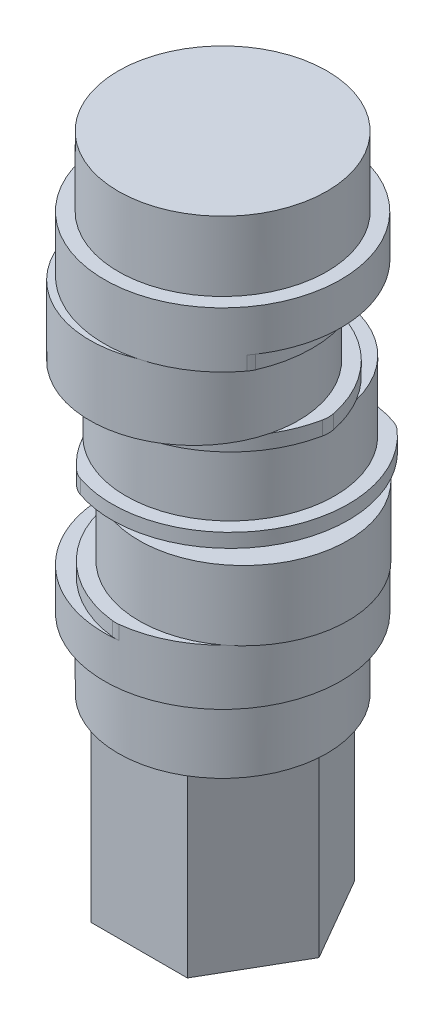
ISO-10303-21;
HEADER;
FILE_DESCRIPTION(('STEP AP214'),'2;1');
FILE_NAME('part.step','',(''),(''),'','','');
FILE_SCHEMA(('AUTOMOTIVE_DESIGN { 1 0 10303 214 1 1 1 1 }'));
ENDSEC;
DATA;
#1=APPLICATION_CONTEXT('core data for automotive mechanical design processes');
#2=APPLICATION_PROTOCOL_DEFINITION('international standard','automotive_design',2000,#1);
#3=PRODUCT_CONTEXT('',#1,'mechanical');
#4=PRODUCT('Part','Part','',(#3));
#5=PRODUCT_RELATED_PRODUCT_CATEGORY('part','',(#4));
#6=PRODUCT_DEFINITION_FORMATION('','',#4);
#7=PRODUCT_DEFINITION_CONTEXT('part definition',#1,'design');
#8=PRODUCT_DEFINITION('design','',#6,#7);
#9=PRODUCT_DEFINITION_SHAPE('','',#8);
#10=(LENGTH_UNIT() NAMED_UNIT(*) SI_UNIT(.MILLI.,.METRE.));
#11=(NAMED_UNIT(*) PLANE_ANGLE_UNIT() SI_UNIT($,.RADIAN.));
#12=(NAMED_UNIT(*) SI_UNIT($,.STERADIAN.) SOLID_ANGLE_UNIT());
#13=UNCERTAINTY_MEASURE_WITH_UNIT(LENGTH_MEASURE(1.E-05),#10,'distance_accuracy_value','');
#14=(GEOMETRIC_REPRESENTATION_CONTEXT(3) GLOBAL_UNCERTAINTY_ASSIGNED_CONTEXT((#13)) GLOBAL_UNIT_ASSIGNED_CONTEXT((#10,
#11,#12)) REPRESENTATION_CONTEXT('',''));
#15=CARTESIAN_POINT('',(0.,0.,0.));
#16=DIRECTION('',(0.,0.,1.));
#17=DIRECTION('',(1.,0.,0.));
#18=AXIS2_PLACEMENT_3D('',#15,#16,#17);
#19=CARTESIAN_POINT('',(0.,21.,0.));
#20=DIRECTION('',(0.,1.,0.));
#21=DIRECTION('',(0.,0.,1.));
#22=AXIS2_PLACEMENT_3D('',#19,#20,#21);
#23=PLANE('',#22);
#24=CARTESIAN_POINT('',(1.5,21.,0.));
#25=DIRECTION('',(0.,1.,0.));
#26=DIRECTION('',(0.,0.,1.));
#27=AXIS2_PLACEMENT_3D('',#24,#25,#26);
#28=CIRCLE('',#27,8.5);
#29=CARTESIAN_POINT('',(0.519230769230769,21.,-8.44322756509478));
#30=VERTEX_POINT('',#29);
#31=CARTESIAN_POINT('',(0.519230769230769,21.,8.44322756509478));
#32=VERTEX_POINT('',#31);
#33=EDGE_CURVE('E368',#30,#32,#28,.T.);
#34=ORIENTED_EDGE('',*,*,#33,.F.);
#35=CARTESIAN_POINT('',(0.75,21.,-6.45658578507248));
#36=DIRECTION('',(0.,1.,0.));
#37=DIRECTION('',(0.,0.,1.));
#38=AXIS2_PLACEMENT_3D('',#35,#36,#37);
#39=CIRCLE('',#38,2.);
#40=CARTESIAN_POINT('',(0.980769230769231,21.,-8.44322756509478));
#41=VERTEX_POINT('',#40);
#42=EDGE_CURVE('E467',#30,#41,#39,.F.);
#43=ORIENTED_EDGE('',*,*,#42,.T.);
#44=CARTESIAN_POINT('',(0.,21.,0.));
#45=DIRECTION('',(0.,-1.,0.));
#46=DIRECTION('',(0.,0.,-1.));
#47=AXIS2_PLACEMENT_3D('',#44,#45,#46);
#48=CIRCLE('',#47,8.5);
#49=CARTESIAN_POINT('',(0.980769230769231,21.,8.44322756509478));
#50=VERTEX_POINT('',#49);
#51=EDGE_CURVE('E269',#50,#41,#48,.T.);
#52=ORIENTED_EDGE('',*,*,#51,.F.);
#53=CARTESIAN_POINT('',(0.75,21.,6.45658578507248));
#54=DIRECTION('',(0.,1.,0.));
#55=DIRECTION('',(0.,0.,1.));
#56=AXIS2_PLACEMENT_3D('',#53,#54,#55);
#57=CIRCLE('',#56,2.);
#58=EDGE_CURVE('E463',#50,#32,#57,.F.);
#59=ORIENTED_EDGE('',*,*,#58,.T.);
#60=EDGE_LOOP('',(#34,#43,#52,#59));
#61=FACE_BOUND('',#60,.T.);
#62=ADVANCED_FACE('F47',(#61),#23,.T.);
#63=CARTESIAN_POINT('',(1.5,22.,0.));
#64=DIRECTION('',(0.,-1.,0.));
#65=DIRECTION('',(0.,0.,-1.));
#66=AXIS2_PLACEMENT_3D('',#63,#64,#65);
#67=CYLINDRICAL_SURFACE('',#66,8.5);
#68=CARTESIAN_POINT('',(1.5,22.,0.));
#69=DIRECTION('',(0.,1.,0.));
#70=DIRECTION('',(0.,0.,1.));
#71=AXIS2_PLACEMENT_3D('',#68,#69,#70);
#72=CIRCLE('',#71,8.5);
#73=CARTESIAN_POINT('',(0.519230769230769,22.,-8.44322756509478));
#74=VERTEX_POINT('',#73);
#75=CARTESIAN_POINT('',(0.519230769230769,22.,8.44322756509478));
#76=VERTEX_POINT('',#75);
#77=EDGE_CURVE('E353',#74,#76,#72,.T.);
#78=ORIENTED_EDGE('',*,*,#77,.F.);
#79=DIRECTION('',(0.,-1.,0.));
#80=VECTOR('',#79,1.);
#81=CARTESIAN_POINT('',(0.519230769230769,22.,-8.44322756509478));
#82=LINE('',#81,#80);
#83=EDGE_CURVE('E459',#74,#30,#82,.T.);
#84=ORIENTED_EDGE('',*,*,#83,.T.);
#85=ORIENTED_EDGE('',*,*,#33,.T.);
#86=DIRECTION('',(0.,-1.,0.));
#87=VECTOR('',#86,1.);
#88=CARTESIAN_POINT('',(0.519230769230769,22.,8.44322756509478));
#89=LINE('',#88,#87);
#90=EDGE_CURVE('E456',#32,#76,#89,.F.);
#91=ORIENTED_EDGE('',*,*,#90,.T.);
#92=EDGE_LOOP('',(#78,#84,#85,#91));
#93=FACE_BOUND('',#92,.T.);
#94=ADVANCED_FACE('F549',(#93),#67,.T.);
#95=CARTESIAN_POINT('',(0.,22.,0.));
#96=DIRECTION('',(0.,-1.,0.));
#97=DIRECTION('',(0.,0.,-1.));
#98=AXIS2_PLACEMENT_3D('',#95,#96,#97);
#99=CYLINDRICAL_SURFACE('',#98,8.5);
#100=DIRECTION('',(0.,-1.,0.));
#101=VECTOR('',#100,1.);
#102=CARTESIAN_POINT('',(0.980769230769231,22.,8.44322756509478));
#103=LINE('',#102,#101);
#104=CARTESIAN_POINT('',(0.980769230769231,22.,8.44322756509478));
#105=VERTEX_POINT('',#104);
#106=EDGE_CURVE('E471',#105,#50,#103,.T.);
#107=ORIENTED_EDGE('',*,*,#106,.T.);
#108=ORIENTED_EDGE('',*,*,#51,.T.);
#109=DIRECTION('',(0.,-1.,0.));
#110=VECTOR('',#109,1.);
#111=CARTESIAN_POINT('',(0.980769230769231,22.,-8.44322756509478));
#112=LINE('',#111,#110);
#113=CARTESIAN_POINT('',(0.980769230769231,22.,-8.44322756509478));
#114=VERTEX_POINT('',#113);
#115=EDGE_CURVE('E475',#41,#114,#112,.F.);
#116=ORIENTED_EDGE('',*,*,#115,.T.);
#117=CARTESIAN_POINT('',(0.,22.,0.));
#118=DIRECTION('',(0.,1.,0.));
#119=DIRECTION('',(0.,0.,1.));
#120=AXIS2_PLACEMENT_3D('',#117,#118,#119);
#121=CIRCLE('',#120,8.5);
#122=CARTESIAN_POINT('',(6.08333333333334,22.,-5.93658618698958));
#123=VERTEX_POINT('',#122);
#124=EDGE_CURVE('E362',#123,#114,#121,.T.);
#125=ORIENTED_EDGE('',*,*,#124,.F.);
#126=CARTESIAN_POINT('',(6.08333333333334,22.,5.93658618698958));
#127=VERTEX_POINT('',#126);
#128=EDGE_CURVE('E367',#127,#123,#121,.T.);
#129=ORIENTED_EDGE('',*,*,#128,.F.);
#130=EDGE_CURVE('E363',#105,#127,#121,.T.);
#131=ORIENTED_EDGE('',*,*,#130,.F.);
#132=EDGE_LOOP('',(#107,#108,#116,#125,#129,#131));
#133=FACE_BOUND('',#132,.T.);
#134=CARTESIAN_POINT('',(0.,18.,0.));
#135=DIRECTION('',(0.,-1.,0.));
#136=DIRECTION('',(0.,0.,-1.));
#137=AXIS2_PLACEMENT_3D('',#134,#135,#136);
#138=CIRCLE('',#137,8.5);
#139=CARTESIAN_POINT('',(0.,18.,-8.5));
#140=VERTEX_POINT('',#139);
#141=EDGE_CURVE('E272',#140,#140,#138,.T.);
#142=ORIENTED_EDGE('',*,*,#141,.F.);
#143=EDGE_LOOP('',(#142));
#144=FACE_BOUND('',#143,.T.);
#145=ADVANCED_FACE('F546',(#133,#144),#99,.T.);
#146=CARTESIAN_POINT('',(0.,22.,0.));
#147=DIRECTION('',(0.,1.,0.));
#148=DIRECTION('',(0.,0.,1.));
#149=AXIS2_PLACEMENT_3D('',#146,#147,#148);
#150=PLANE('',#149);
#151=ORIENTED_EDGE('',*,*,#124,.T.);
#152=CARTESIAN_POINT('',(0.75,22.,-6.45658578507248));
#153=DIRECTION('',(0.,1.,0.));
#154=DIRECTION('',(0.,0.,1.));
#155=AXIS2_PLACEMENT_3D('',#152,#153,#154);
#156=CIRCLE('',#155,2.);
#157=EDGE_CURVE('E481',#114,#74,#156,.T.);
#158=ORIENTED_EDGE('',*,*,#157,.T.);
#159=ORIENTED_EDGE('',*,*,#77,.T.);
#160=CARTESIAN_POINT('',(0.75,22.,6.45658578507248));
#161=DIRECTION('',(0.,1.,0.));
#162=DIRECTION('',(0.,0.,1.));
#163=AXIS2_PLACEMENT_3D('',#160,#161,#162);
#164=CIRCLE('',#163,2.);
#165=EDGE_CURVE('E478',#76,#105,#164,.T.);
#166=ORIENTED_EDGE('',*,*,#165,.T.);
#167=ORIENTED_EDGE('',*,*,#130,.T.);
#168=CARTESIAN_POINT('',(1.5,22.,0.));
#169=DIRECTION('',(0.,1.,0.));
#170=DIRECTION('',(0.,0.,1.));
#171=AXIS2_PLACEMENT_3D('',#168,#169,#170);
#172=CIRCLE('',#171,7.5);
#173=EDGE_CURVE('E358',#123,#127,#172,.T.);
#174=ORIENTED_EDGE('',*,*,#173,.F.);
#175=EDGE_LOOP('',(#151,#158,#159,#166,#167,#174));
#176=FACE_BOUND('',#175,.T.);
#177=ADVANCED_FACE('F548',(#176),#150,.T.);
#178=CARTESIAN_POINT('',(1.5,22.,0.));
#179=DIRECTION('',(0.,1.,0.));
#180=DIRECTION('',(0.,0.,1.));
#181=AXIS2_PLACEMENT_3D('',#178,#179,#180);
#182=PLANE('',#181);
#183=EDGE_CURVE('E340',#127,#123,#172,.T.);
#184=ORIENTED_EDGE('',*,*,#183,.F.);
#185=ORIENTED_EDGE('',*,*,#128,.T.);
#186=EDGE_LOOP('',(#184,#185));
#187=FACE_BOUND('',#186,.T.);
#188=ADVANCED_FACE('F557',(#187),#182,.F.);
#189=CARTESIAN_POINT('',(1.5,27.,0.));
#190=DIRECTION('',(0.,-1.,0.));
#191=DIRECTION('',(0.,0.,-1.));
#192=AXIS2_PLACEMENT_3D('',#189,#190,#191);
#193=CYLINDRICAL_SURFACE('',#192,7.5);
#194=CARTESIAN_POINT('',(1.5,27.,0.));
#195=DIRECTION('',(0.,1.,0.));
#196=DIRECTION('',(0.,0.,1.));
#197=AXIS2_PLACEMENT_3D('',#194,#195,#196);
#198=CIRCLE('',#197,7.5);
#199=CARTESIAN_POINT('',(6.68450273621876,27.,-5.41949549110803));
#200=VERTEX_POINT('',#199);
#201=CARTESIAN_POINT('',(-0.601169402885409,27.,7.19965882110938));
#202=VERTEX_POINT('',#201);
#203=EDGE_CURVE('E349',#200,#202,#198,.T.);
#204=ORIENTED_EDGE('',*,*,#203,.F.);
#205=EDGE_CURVE('E354',#202,#200,#198,.T.);
#206=ORIENTED_EDGE('',*,*,#205,.F.);
#207=EDGE_LOOP('',(#204,#206));
#208=FACE_BOUND('',#207,.T.);
#209=ORIENTED_EDGE('',*,*,#183,.T.);
#210=ORIENTED_EDGE('',*,*,#173,.T.);
#211=EDGE_LOOP('',(#209,#210));
#212=FACE_BOUND('',#211,.T.);
#213=ADVANCED_FACE('F733',(#208,#212),#193,.T.);
#214=CARTESIAN_POINT('',(1.5,27.,0.));
#215=DIRECTION('',(0.,1.,0.));
#216=DIRECTION('',(0.,0.,1.));
#217=AXIS2_PLACEMENT_3D('',#214,#215,#216);
#218=PLANE('',#217);
#219=CARTESIAN_POINT('',(-0.749999999999997,27.,-1.29903810567666));
#220=DIRECTION('',(0.,1.,0.));
#221=DIRECTION('',(0.,0.,1.));
#222=AXIS2_PLACEMENT_3D('',#219,#220,#221);
#223=CIRCLE('',#222,8.5);
#224=EDGE_CURVE('E345',#202,#200,#223,.T.);
#225=ORIENTED_EDGE('',*,*,#224,.F.);
#226=ORIENTED_EDGE('',*,*,#205,.T.);
#227=EDGE_LOOP('',(#225,#226));
#228=FACE_BOUND('',#227,.T.);
#229=ADVANCED_FACE('F723',(#228),#218,.T.);
#230=CARTESIAN_POINT('',(0.,27.,0.));
#231=DIRECTION('',(0.,1.,0.));
#232=DIRECTION('',(0.,0.,1.));
#233=AXIS2_PLACEMENT_3D('',#230,#231,#232);
#234=PLANE('',#233);
#235=CARTESIAN_POINT('',(-3.44310704708787,27.,6.76304440648641));
#236=VERTEX_POINT('',#235);
#237=EDGE_CURVE('E342',#236,#202,#223,.T.);
#238=ORIENTED_EDGE('',*,*,#237,.F.);
#239=CARTESIAN_POINT('',(-2.80943480071425,27.,4.86608381538922));
#240=DIRECTION('',(0.,1.,0.));
#241=DIRECTION('',(0.,0.,1.));
#242=AXIS2_PLACEMENT_3D('',#239,#240,#241);
#243=CIRCLE('',#242,2.);
#244=CARTESIAN_POINT('',(-4.13541473939556,27.,6.36334037397052));
#245=VERTEX_POINT('',#244);
#246=EDGE_CURVE('E494',#236,#245,#243,.F.);
#247=ORIENTED_EDGE('',*,*,#246,.T.);
#248=CARTESIAN_POINT('',(1.5,27.,0.));
#249=DIRECTION('',(0.,1.,0.));
#250=DIRECTION('',(0.,0.,1.));
#251=AXIS2_PLACEMENT_3D('',#248,#249,#250);
#252=CIRCLE('',#251,8.5);
#253=CARTESIAN_POINT('',(4.19310704708788,27.,-8.06208251216307));
#254=VERTEX_POINT('',#253);
#255=EDGE_CURVE('E336',#254,#245,#252,.T.);
#256=ORIENTED_EDGE('',*,*,#255,.F.);
#257=CARTESIAN_POINT('',(3.55943480071426,27.,-6.16512192106588));
#258=DIRECTION('',(0.,1.,0.));
#259=DIRECTION('',(0.,0.,1.));
#260=AXIS2_PLACEMENT_3D('',#257,#258,#259);
#261=CIRCLE('',#260,2.);
#262=CARTESIAN_POINT('',(4.88541473939557,27.,-7.66237847964718));
#263=VERTEX_POINT('',#262);
#264=EDGE_CURVE('E491',#254,#263,#261,.F.);
#265=ORIENTED_EDGE('',*,*,#264,.T.);
#266=EDGE_CURVE('E325',#200,#263,#223,.T.);
#267=ORIENTED_EDGE('',*,*,#266,.F.);
#268=ORIENTED_EDGE('',*,*,#203,.T.);
#269=EDGE_LOOP('',(#238,#247,#256,#265,#267,#268));
#270=FACE_BOUND('',#269,.T.);
#271=ADVANCED_FACE('F719',(#270),#234,.F.);
#272=CARTESIAN_POINT('',(-0.749999999999997,28.,-1.29903810567666));
#273=DIRECTION('',(0.,-1.,0.));
#274=DIRECTION('',(0.,0.,-1.));
#275=AXIS2_PLACEMENT_3D('',#272,#273,#274);
#276=CYLINDRICAL_SURFACE('',#275,8.5);
#277=CARTESIAN_POINT('',(-0.749999999999997,28.,-1.29903810567666));
#278=DIRECTION('',(0.,1.,0.));
#279=DIRECTION('',(0.,0.,1.));
#280=AXIS2_PLACEMENT_3D('',#277,#278,#279);
#281=CIRCLE('',#280,8.5);
#282=CARTESIAN_POINT('',(-3.44310704708787,28.,6.76304440648641));
#283=VERTEX_POINT('',#282);
#284=CARTESIAN_POINT('',(4.88541473939557,28.,-7.66237847964718));
#285=VERTEX_POINT('',#284);
#286=EDGE_CURVE('E331',#283,#285,#281,.T.);
#287=ORIENTED_EDGE('',*,*,#286,.F.);
#288=DIRECTION('',(0.,-1.,0.));
#289=VECTOR('',#288,1.);
#290=CARTESIAN_POINT('',(-3.44310704708787,28.,6.76304440648641));
#291=LINE('',#290,#289);
#292=EDGE_CURVE('E487',#283,#236,#291,.T.);
#293=ORIENTED_EDGE('',*,*,#292,.T.);
#294=ORIENTED_EDGE('',*,*,#237,.T.);
#295=ORIENTED_EDGE('',*,*,#224,.T.);
#296=ORIENTED_EDGE('',*,*,#266,.T.);
#297=DIRECTION('',(0.,-1.,0.));
#298=VECTOR('',#297,1.);
#299=CARTESIAN_POINT('',(4.88541473939557,28.,-7.66237847964718));
#300=LINE('',#299,#298);
#301=EDGE_CURVE('E484',#263,#285,#300,.F.);
#302=ORIENTED_EDGE('',*,*,#301,.T.);
#303=EDGE_LOOP('',(#287,#293,#294,#295,#296,#302));
#304=FACE_BOUND('',#303,.T.);
#305=ADVANCED_FACE('F722',(#304),#276,.T.);
#306=CARTESIAN_POINT('',(1.5,28.,0.));
#307=DIRECTION('',(0.,-1.,0.));
#308=DIRECTION('',(0.,0.,-1.));
#309=AXIS2_PLACEMENT_3D('',#306,#307,#308);
#310=CYLINDRICAL_SURFACE('',#309,8.5);
#311=ORIENTED_EDGE('',*,*,#255,.T.);
#312=DIRECTION('',(0.,-1.,0.));
#313=VECTOR('',#312,1.);
#314=CARTESIAN_POINT('',(-4.13541473939556,28.,6.36334037397052));
#315=LINE('',#314,#313);
#316=CARTESIAN_POINT('',(-4.13541473939556,28.,6.36334037397052));
#317=VERTEX_POINT('',#316);
#318=EDGE_CURVE('E501',#245,#317,#315,.F.);
#319=ORIENTED_EDGE('',*,*,#318,.T.);
#320=CARTESIAN_POINT('',(1.5,28.,0.));
#321=DIRECTION('',(0.,1.,0.));
#322=DIRECTION('',(0.,0.,1.));
#323=AXIS2_PLACEMENT_3D('',#320,#321,#322);
#324=CIRCLE('',#323,8.5);
#325=CARTESIAN_POINT('',(-5.93450273621875,28.,4.12045738543137));
#326=VERTEX_POINT('',#325);
#327=EDGE_CURVE('E335',#326,#317,#324,.T.);
#328=ORIENTED_EDGE('',*,*,#327,.F.);
#329=CARTESIAN_POINT('',(1.35116940288542,28.,-8.49869692678604));
#330=VERTEX_POINT('',#329);
#331=EDGE_CURVE('E341',#330,#326,#324,.T.);
#332=ORIENTED_EDGE('',*,*,#331,.F.);
#333=CARTESIAN_POINT('',(4.19310704708788,28.,-8.06208251216307));
#334=VERTEX_POINT('',#333);
#335=EDGE_CURVE('E337',#334,#330,#324,.T.);
#336=ORIENTED_EDGE('',*,*,#335,.F.);
#337=DIRECTION('',(0.,-1.,0.));
#338=VECTOR('',#337,1.);
#339=CARTESIAN_POINT('',(4.19310704708788,28.,-8.06208251216307));
#340=LINE('',#339,#338);
#341=EDGE_CURVE('E497',#334,#254,#340,.T.);
#342=ORIENTED_EDGE('',*,*,#341,.T.);
#343=EDGE_LOOP('',(#311,#319,#328,#332,#336,#342));
#344=FACE_BOUND('',#343,.T.);
#345=ADVANCED_FACE('F717',(#344),#310,.T.);
#346=CARTESIAN_POINT('',(0.,28.,0.));
#347=DIRECTION('',(0.,1.,0.));
#348=DIRECTION('',(0.,0.,1.));
#349=AXIS2_PLACEMENT_3D('',#346,#347,#348);
#350=PLANE('',#349);
#351=ORIENTED_EDGE('',*,*,#327,.T.);
#352=CARTESIAN_POINT('',(-2.80943480071425,28.,4.86608381538922));
#353=DIRECTION('',(0.,1.,0.));
#354=DIRECTION('',(0.,0.,1.));
#355=AXIS2_PLACEMENT_3D('',#352,#353,#354);
#356=CIRCLE('',#355,2.);
#357=EDGE_CURVE('E507',#317,#283,#356,.T.);
#358=ORIENTED_EDGE('',*,*,#357,.T.);
#359=ORIENTED_EDGE('',*,*,#286,.T.);
#360=CARTESIAN_POINT('',(3.55943480071426,28.,-6.16512192106588));
#361=DIRECTION('',(0.,1.,0.));
#362=DIRECTION('',(0.,0.,1.));
#363=AXIS2_PLACEMENT_3D('',#360,#361,#362);
#364=CIRCLE('',#363,2.);
#365=EDGE_CURVE('E504',#285,#334,#364,.T.);
#366=ORIENTED_EDGE('',*,*,#365,.T.);
#367=ORIENTED_EDGE('',*,*,#335,.T.);
#368=CARTESIAN_POINT('',(-0.749999999999997,28.,-1.29903810567666));
#369=DIRECTION('',(0.,1.,0.));
#370=DIRECTION('',(0.,0.,1.));
#371=AXIS2_PLACEMENT_3D('',#368,#369,#370);
#372=CIRCLE('',#371,7.5);
#373=EDGE_CURVE('E330',#326,#330,#372,.T.);
#374=ORIENTED_EDGE('',*,*,#373,.F.);
#375=EDGE_LOOP('',(#351,#358,#359,#366,#367,#374));
#376=FACE_BOUND('',#375,.T.);
#377=ADVANCED_FACE('F711',(#376),#350,.T.);
#378=CARTESIAN_POINT('',(-0.749999999999997,28.,-1.29903810567666));
#379=DIRECTION('',(0.,1.,0.));
#380=DIRECTION('',(0.,0.,1.));
#381=AXIS2_PLACEMENT_3D('',#378,#379,#380);
#382=PLANE('',#381);
#383=EDGE_CURVE('E314',#330,#326,#372,.T.);
#384=ORIENTED_EDGE('',*,*,#383,.F.);
#385=ORIENTED_EDGE('',*,*,#331,.T.);
#386=EDGE_LOOP('',(#384,#385));
#387=FACE_BOUND('',#386,.T.);
#388=ADVANCED_FACE('F708',(#387),#382,.F.);
#389=CARTESIAN_POINT('',(-0.749999999999997,33.,-1.29903810567666));
#390=DIRECTION('',(0.,-1.,0.));
#391=DIRECTION('',(0.,0.,-1.));
#392=AXIS2_PLACEMENT_3D('',#389,#390,#391);
#393=CYLINDRICAL_SURFACE('',#392,7.5);
#394=CARTESIAN_POINT('',(-0.749999999999997,33.,-1.29903810567666));
#395=DIRECTION('',(0.,1.,0.));
#396=DIRECTION('',(0.,0.,1.));
#397=AXIS2_PLACEMENT_3D('',#394,#395,#396);
#398=CIRCLE('',#397,7.5);
#399=CARTESIAN_POINT('',(6.53567213910416,33.,-3.07920143567799));
#400=VERTEX_POINT('',#399);
#401=CARTESIAN_POINT('',(-8.03567213910414,33.,-3.07920143567804));
#402=VERTEX_POINT('',#401);
#403=EDGE_CURVE('E322',#400,#402,#398,.T.);
#404=ORIENTED_EDGE('',*,*,#403,.F.);
#405=EDGE_CURVE('E326',#402,#400,#398,.T.);
#406=ORIENTED_EDGE('',*,*,#405,.F.);
#407=EDGE_LOOP('',(#404,#406));
#408=FACE_BOUND('',#407,.T.);
#409=ORIENTED_EDGE('',*,*,#383,.T.);
#410=ORIENTED_EDGE('',*,*,#373,.T.);
#411=EDGE_LOOP('',(#409,#410));
#412=FACE_BOUND('',#411,.T.);
#413=ADVANCED_FACE('F654',(#408,#412),#393,.T.);
#414=CARTESIAN_POINT('',(-0.749999999999997,33.,-1.29903810567666));
#415=DIRECTION('',(0.,1.,0.));
#416=DIRECTION('',(0.,0.,1.));
#417=AXIS2_PLACEMENT_3D('',#414,#415,#416);
#418=PLANE('',#417);
#419=CARTESIAN_POINT('',(-0.750000000000006,33.,1.29903810567665));
#420=DIRECTION('',(0.,1.,0.));
#421=DIRECTION('',(0.,0.,1.));
#422=AXIS2_PLACEMENT_3D('',#419,#420,#421);
#423=CIRCLE('',#422,8.5);
#424=EDGE_CURVE('E319',#400,#402,#423,.T.);
#425=ORIENTED_EDGE('',*,*,#424,.F.);
#426=ORIENTED_EDGE('',*,*,#403,.T.);
#427=EDGE_LOOP('',(#425,#426));
#428=FACE_BOUND('',#427,.T.);
#429=ADVANCED_FACE('F651',(#428),#418,.T.);
#430=CARTESIAN_POINT('',(0.,33.,0.));
#431=DIRECTION('',(0.,1.,0.));
#432=DIRECTION('',(0.,0.,1.));
#433=AXIS2_PLACEMENT_3D('',#430,#431,#432);
#434=PLANE('',#433);
#435=CARTESIAN_POINT('',(7.57852178648342,33.,-0.399704032515868));
#436=VERTEX_POINT('',#435);
#437=EDGE_CURVE('E316',#436,#400,#423,.T.);
#438=ORIENTED_EDGE('',*,*,#437,.F.);
#439=CARTESIAN_POINT('',(5.6188696014285,33.,0.));
#440=DIRECTION('',(0.,1.,0.));
#441=DIRECTION('',(0.,0.,1.));
#442=AXIS2_PLACEMENT_3D('',#439,#440,#441);
#443=CIRCLE('',#442,2.);
#444=CARTESIAN_POINT('',(7.57852178648342,33.,0.399704032515922));
#445=VERTEX_POINT('',#444);
#446=EDGE_CURVE('E520',#436,#445,#443,.F.);
#447=ORIENTED_EDGE('',*,*,#446,.T.);
#448=CARTESIAN_POINT('',(-0.749999999999997,33.,-1.29903810567666));
#449=DIRECTION('',(0.,1.,0.));
#450=DIRECTION('',(0.,0.,1.));
#451=AXIS2_PLACEMENT_3D('',#448,#449,#450);
#452=CIRCLE('',#451,8.5);
#453=CARTESIAN_POINT('',(-9.07852178648343,33.,0.399704032515863));
#454=VERTEX_POINT('',#453);
#455=EDGE_CURVE('E310',#454,#445,#452,.T.);
#456=ORIENTED_EDGE('',*,*,#455,.F.);
#457=CARTESIAN_POINT('',(-7.1188696014285,33.,0.));
#458=DIRECTION('',(0.,1.,0.));
#459=DIRECTION('',(0.,0.,1.));
#460=AXIS2_PLACEMENT_3D('',#457,#458,#459);
#461=CIRCLE('',#460,2.);
#462=CARTESIAN_POINT('',(-9.07852178648342,33.,-0.399704032515927));
#463=VERTEX_POINT('',#462);
#464=EDGE_CURVE('E517',#454,#463,#461,.F.);
#465=ORIENTED_EDGE('',*,*,#464,.T.);
#466=EDGE_CURVE('E300',#402,#463,#423,.T.);
#467=ORIENTED_EDGE('',*,*,#466,.F.);
#468=ORIENTED_EDGE('',*,*,#405,.T.);
#469=EDGE_LOOP('',(#438,#447,#456,#465,#467,#468));
#470=FACE_BOUND('',#469,.T.);
#471=ADVANCED_FACE('F645',(#470),#434,.F.);
#472=CARTESIAN_POINT('',(-0.750000000000006,34.,1.29903810567665));
#473=DIRECTION('',(0.,-1.,0.));
#474=DIRECTION('',(0.,0.,-1.));
#475=AXIS2_PLACEMENT_3D('',#472,#473,#474);
#476=CYLINDRICAL_SURFACE('',#475,8.5);
#477=CARTESIAN_POINT('',(-0.750000000000006,34.,1.29903810567665));
#478=DIRECTION('',(0.,1.,0.));
#479=DIRECTION('',(0.,0.,1.));
#480=AXIS2_PLACEMENT_3D('',#477,#478,#479);
#481=CIRCLE('',#480,8.5);
#482=CARTESIAN_POINT('',(7.57852178648342,34.,-0.399704032515868));
#483=VERTEX_POINT('',#482);
#484=CARTESIAN_POINT('',(-9.07852178648342,34.,-0.399704032515927));
#485=VERTEX_POINT('',#484);
#486=EDGE_CURVE('E306',#483,#485,#481,.T.);
#487=ORIENTED_EDGE('',*,*,#486,.F.);
#488=DIRECTION('',(0.,-1.,0.));
#489=VECTOR('',#488,1.);
#490=CARTESIAN_POINT('',(7.57852178648342,34.,-0.399704032515867));
#491=LINE('',#490,#489);
#492=EDGE_CURVE('E513',#483,#436,#491,.T.);
#493=ORIENTED_EDGE('',*,*,#492,.T.);
#494=ORIENTED_EDGE('',*,*,#437,.T.);
#495=ORIENTED_EDGE('',*,*,#424,.T.);
#496=ORIENTED_EDGE('',*,*,#466,.T.);
#497=DIRECTION('',(0.,-1.,0.));
#498=VECTOR('',#497,1.);
#499=CARTESIAN_POINT('',(-9.07852178648342,34.,-0.399704032515927));
#500=LINE('',#499,#498);
#501=EDGE_CURVE('E510',#463,#485,#500,.F.);
#502=ORIENTED_EDGE('',*,*,#501,.T.);
#503=EDGE_LOOP('',(#487,#493,#494,#495,#496,#502));
#504=FACE_BOUND('',#503,.T.);
#505=ADVANCED_FACE('F634',(#504),#476,.T.);
#506=CARTESIAN_POINT('',(-0.749999999999997,34.,-1.29903810567666));
#507=DIRECTION('',(0.,-1.,0.));
#508=DIRECTION('',(0.,0.,-1.));
#509=AXIS2_PLACEMENT_3D('',#506,#507,#508);
#510=CYLINDRICAL_SURFACE('',#509,8.5);
#511=ORIENTED_EDGE('',*,*,#455,.T.);
#512=DIRECTION('',(0.,-1.,0.));
#513=VECTOR('',#512,1.);
#514=CARTESIAN_POINT('',(7.57852178648342,34.,0.399704032515922));
#515=LINE('',#514,#513);
#516=CARTESIAN_POINT('',(7.57852178648342,34.,0.399704032515922));
#517=VERTEX_POINT('',#516);
#518=EDGE_CURVE('E71',#445,#517,#515,.F.);
#519=ORIENTED_EDGE('',*,*,#518,.T.);
#520=CARTESIAN_POINT('',(-0.749999999999997,34.,-1.29903810567666));
#521=DIRECTION('',(0.,1.,0.));
#522=DIRECTION('',(0.,0.,1.));
#523=AXIS2_PLACEMENT_3D('',#520,#521,#522);
#524=CIRCLE('',#523,8.5);
#525=CARTESIAN_POINT('',(6.53567213910414,34.,3.07920143567803));
#526=VERTEX_POINT('',#525);
#527=EDGE_CURVE('E309',#526,#517,#524,.T.);
#528=ORIENTED_EDGE('',*,*,#527,.F.);
#529=CARTESIAN_POINT('',(-8.03567213910417,34.,3.07920143567798));
#530=VERTEX_POINT('',#529);
#531=EDGE_CURVE('E315',#530,#526,#524,.T.);
#532=ORIENTED_EDGE('',*,*,#531,.F.);
#533=CARTESIAN_POINT('',(-9.07852178648343,34.,0.399704032515863));
#534=VERTEX_POINT('',#533);
#535=EDGE_CURVE('E311',#534,#530,#524,.T.);
#536=ORIENTED_EDGE('',*,*,#535,.F.);
#537=DIRECTION('',(0.,-1.,0.));
#538=VECTOR('',#537,1.);
#539=CARTESIAN_POINT('',(-9.07852178648342,34.,0.399704032515862));
#540=LINE('',#539,#538);
#541=EDGE_CURVE('E523',#534,#454,#540,.T.);
#542=ORIENTED_EDGE('',*,*,#541,.T.);
#543=EDGE_LOOP('',(#511,#519,#528,#532,#536,#542));
#544=FACE_BOUND('',#543,.T.);
#545=ADVANCED_FACE('F642',(#544),#510,.T.);
#546=CARTESIAN_POINT('',(0.,34.,0.));
#547=DIRECTION('',(0.,1.,0.));
#548=DIRECTION('',(0.,0.,1.));
#549=AXIS2_PLACEMENT_3D('',#546,#547,#548);
#550=PLANE('',#549);
#551=ORIENTED_EDGE('',*,*,#527,.T.);
#552=CARTESIAN_POINT('',(5.6188696014285,34.,0.));
#553=DIRECTION('',(0.,1.,0.));
#554=DIRECTION('',(0.,0.,1.));
#555=AXIS2_PLACEMENT_3D('',#552,#553,#554);
#556=CIRCLE('',#555,2.);
#557=EDGE_CURVE('E56',#517,#483,#556,.T.);
#558=ORIENTED_EDGE('',*,*,#557,.T.);
#559=ORIENTED_EDGE('',*,*,#486,.T.);
#560=CARTESIAN_POINT('',(-7.1188696014285,34.,0.));
#561=DIRECTION('',(0.,1.,0.));
#562=DIRECTION('',(0.,0.,1.));
#563=AXIS2_PLACEMENT_3D('',#560,#561,#562);
#564=CIRCLE('',#563,2.);
#565=EDGE_CURVE('E63',#485,#534,#564,.T.);
#566=ORIENTED_EDGE('',*,*,#565,.T.);
#567=ORIENTED_EDGE('',*,*,#535,.T.);
#568=CARTESIAN_POINT('',(-0.750000000000006,34.,1.29903810567665));
#569=DIRECTION('',(0.,1.,0.));
#570=DIRECTION('',(0.,0.,1.));
#571=AXIS2_PLACEMENT_3D('',#568,#569,#570);
#572=CIRCLE('',#571,7.5);
#573=EDGE_CURVE('E302',#526,#530,#572,.T.);
#574=ORIENTED_EDGE('',*,*,#573,.F.);
#575=EDGE_LOOP('',(#551,#558,#559,#566,#567,#574));
#576=FACE_BOUND('',#575,.T.);
#577=ADVANCED_FACE('F632',(#576),#550,.T.);
#578=CARTESIAN_POINT('',(-0.750000000000006,34.,1.29903810567665));
#579=DIRECTION('',(0.,1.,0.));
#580=DIRECTION('',(0.,0.,1.));
#581=AXIS2_PLACEMENT_3D('',#578,#579,#580);
#582=PLANE('',#581);
#583=EDGE_CURVE('E287',#530,#526,#572,.T.);
#584=ORIENTED_EDGE('',*,*,#583,.F.);
#585=ORIENTED_EDGE('',*,*,#531,.T.);
#586=EDGE_LOOP('',(#584,#585));
#587=FACE_BOUND('',#586,.T.);
#588=ADVANCED_FACE('F692',(#587),#582,.F.);
#589=CARTESIAN_POINT('',(-0.750000000000006,39.,1.29903810567665));
#590=DIRECTION('',(0.,-1.,0.));
#591=DIRECTION('',(0.,0.,-1.));
#592=AXIS2_PLACEMENT_3D('',#589,#590,#591);
#593=CYLINDRICAL_SURFACE('',#592,7.5);
#594=CARTESIAN_POINT('',(-0.750000000000006,39.,1.29903810567665));
#595=DIRECTION('',(0.,1.,0.));
#596=DIRECTION('',(0.,0.,1.));
#597=AXIS2_PLACEMENT_3D('',#594,#595,#596);
#598=CIRCLE('',#597,7.5);
#599=CARTESIAN_POINT('',(2.09956778302207,39.,8.23661429985014));
#600=VERTEX_POINT('',#599);
#601=CARTESIAN_POINT('',(-8.18290111635545,39.,2.30002811286051));
#602=VERTEX_POINT('',#601);
#603=EDGE_CURVE('E296',#600,#602,#598,.T.);
#604=ORIENTED_EDGE('',*,*,#603,.F.);
#605=EDGE_CURVE('E301',#602,#600,#598,.T.);
#606=ORIENTED_EDGE('',*,*,#605,.F.);
#607=EDGE_LOOP('',(#604,#606));
#608=FACE_BOUND('',#607,.T.);
#609=ORIENTED_EDGE('',*,*,#573,.T.);
#610=ORIENTED_EDGE('',*,*,#583,.T.);
#611=EDGE_LOOP('',(#609,#610));
#612=FACE_BOUND('',#611,.T.);
#613=ADVANCED_FACE('F671',(#608,#612),#593,.T.);
#614=CARTESIAN_POINT('',(-0.750000000000006,39.,1.29903810567665));
#615=DIRECTION('',(0.,1.,0.));
#616=DIRECTION('',(0.,0.,1.));
#617=AXIS2_PLACEMENT_3D('',#614,#615,#616);
#618=PLANE('',#617);
#619=CARTESIAN_POINT('',(0.,39.,0.));
#620=DIRECTION('',(0.,1.,0.));
#621=DIRECTION('',(0.,0.,1.));
#622=AXIS2_PLACEMENT_3D('',#619,#620,#621);
#623=CIRCLE('',#622,8.5);
#624=EDGE_CURVE('E292',#602,#600,#623,.T.);
#625=ORIENTED_EDGE('',*,*,#624,.F.);
#626=ORIENTED_EDGE('',*,*,#605,.T.);
#627=EDGE_LOOP('',(#625,#626));
#628=FACE_BOUND('',#627,.T.);
#629=ADVANCED_FACE('F669',(#628),#618,.T.);
#630=CARTESIAN_POINT('',(0.,39.,0.));
#631=DIRECTION('',(0.,1.,0.));
#632=DIRECTION('',(0.,0.,1.));
#633=AXIS2_PLACEMENT_3D('',#630,#631,#632);
#634=PLANE('',#633);
#635=CARTESIAN_POINT('',(-0.750000000000006,39.,1.29903810567665));
#636=DIRECTION('',(0.,1.,0.));
#637=DIRECTION('',(0.,0.,1.));
#638=AXIS2_PLACEMENT_3D('',#635,#636,#637);
#639=CIRCLE('',#638,8.5);
#640=CARTESIAN_POINT('',(7.0524341766897,39.,4.67128081912781));
#641=VERTEX_POINT('',#640);
#642=CARTESIAN_POINT('',(-7.57166494592048,39.,-3.77194674596704));
#643=VERTEX_POINT('',#642);
#644=EDGE_CURVE('E288',#641,#643,#639,.T.);
#645=ORIENTED_EDGE('',*,*,#644,.F.);
#646=CARTESIAN_POINT('',(5.21656731158624,39.,3.87781194537459));
#647=DIRECTION('',(0.,1.,0.));
#648=DIRECTION('',(0.,0.,1.));
#649=AXIS2_PLACEMENT_3D('',#646,#647,#648);
#650=CIRCLE('',#649,2.);
#651=CARTESIAN_POINT('',(6.82166494592047,39.,5.0709848516437));
#652=VERTEX_POINT('',#651);
#653=EDGE_CURVE('E247',#641,#652,#650,.F.);
#654=ORIENTED_EDGE('',*,*,#653,.T.);
#655=EDGE_CURVE('E284',#600,#652,#623,.T.);
#656=ORIENTED_EDGE('',*,*,#655,.F.);
#657=ORIENTED_EDGE('',*,*,#603,.T.);
#658=CARTESIAN_POINT('',(-7.80243417668971,39.,-3.37224271345115));
#659=VERTEX_POINT('',#658);
#660=EDGE_CURVE('E289',#659,#602,#623,.T.);
#661=ORIENTED_EDGE('',*,*,#660,.F.);
#662=CARTESIAN_POINT('',(-5.96656731158625,39.,-2.57877383969794));
#663=DIRECTION('',(0.,1.,0.));
#664=DIRECTION('',(0.,0.,1.));
#665=AXIS2_PLACEMENT_3D('',#662,#663,#664);
#666=CIRCLE('',#665,2.);
#667=EDGE_CURVE('E241',#659,#643,#666,.F.);
#668=ORIENTED_EDGE('',*,*,#667,.T.);
#669=EDGE_LOOP('',(#645,#654,#656,#657,#661,#668));
#670=FACE_BOUND('',#669,.T.);
#671=ADVANCED_FACE('F675',(#670),#634,.F.);
#672=CARTESIAN_POINT('',(0.,40.,0.));
#673=DIRECTION('',(0.,-1.,0.));
#674=DIRECTION('',(0.,0.,-1.));
#675=AXIS2_PLACEMENT_3D('',#672,#673,#674);
#676=CYLINDRICAL_SURFACE('',#675,8.5);
#677=ORIENTED_EDGE('',*,*,#655,.T.);
#678=DIRECTION('',(0.,-1.,0.));
#679=VECTOR('',#678,1.);
#680=CARTESIAN_POINT('',(6.82166494592047,40.,5.0709848516437));
#681=LINE('',#680,#679);
#682=CARTESIAN_POINT('',(6.82166494592047,40.,5.0709848516437));
#683=VERTEX_POINT('',#682);
#684=EDGE_CURVE('E246',#652,#683,#681,.F.);
#685=ORIENTED_EDGE('',*,*,#684,.T.);
#686=CARTESIAN_POINT('',(0.,40.,0.));
#687=DIRECTION('',(0.,-1.,0.));
#688=DIRECTION('',(0.,0.,-1.));
#689=AXIS2_PLACEMENT_3D('',#686,#687,#688);
#690=CIRCLE('',#689,8.5);
#691=CARTESIAN_POINT('',(-7.80243417668971,40.,-3.37224271345115));
#692=VERTEX_POINT('',#691);
#693=EDGE_CURVE('E253',#692,#683,#690,.T.);
#694=ORIENTED_EDGE('',*,*,#693,.F.);
#695=DIRECTION('',(0.,-1.,0.));
#696=VECTOR('',#695,1.);
#697=CARTESIAN_POINT('',(-7.80243417668971,40.,-3.37224271345115));
#698=LINE('',#697,#696);
#699=EDGE_CURVE('E236',#692,#659,#698,.T.);
#700=ORIENTED_EDGE('',*,*,#699,.T.);
#701=ORIENTED_EDGE('',*,*,#660,.T.);
#702=ORIENTED_EDGE('',*,*,#624,.T.);
#703=EDGE_LOOP('',(#677,#685,#694,#700,#701,#702));
#704=FACE_BOUND('',#703,.T.);
#705=CARTESIAN_POINT('',(0.,43.,0.));
#706=DIRECTION('',(0.,-1.,0.));
#707=DIRECTION('',(0.,0.,-1.));
#708=AXIS2_PLACEMENT_3D('',#705,#706,#707);
#709=CIRCLE('',#708,8.5);
#710=CARTESIAN_POINT('',(0.,43.,-8.5));
#711=VERTEX_POINT('',#710);
#712=EDGE_CURVE('E265',#711,#711,#709,.T.);
#713=ORIENTED_EDGE('',*,*,#712,.T.);
#714=EDGE_LOOP('',(#713));
#715=FACE_BOUND('',#714,.T.);
#716=ADVANCED_FACE('F260',(#704,#715),#676,.T.);
#717=CARTESIAN_POINT('',(-0.750000000000006,40.,1.29903810567665));
#718=DIRECTION('',(0.,-1.,0.));
#719=DIRECTION('',(0.,0.,-1.));
#720=AXIS2_PLACEMENT_3D('',#717,#718,#719);
#721=CYLINDRICAL_SURFACE('',#720,8.5);
#722=CARTESIAN_POINT('',(-0.750000000000006,40.,1.29903810567665));
#723=DIRECTION('',(0.,1.,0.));
#724=DIRECTION('',(0.,0.,1.));
#725=AXIS2_PLACEMENT_3D('',#722,#723,#724);
#726=CIRCLE('',#725,8.5);
#727=CARTESIAN_POINT('',(7.0524341766897,40.,4.67128081912781));
#728=VERTEX_POINT('',#727);
#729=CARTESIAN_POINT('',(-7.57166494592048,40.,-3.77194674596704));
#730=VERTEX_POINT('',#729);
#731=EDGE_CURVE('E254',#728,#730,#726,.T.);
#732=ORIENTED_EDGE('',*,*,#731,.F.);
#733=DIRECTION('',(0.,-1.,0.));
#734=VECTOR('',#733,1.);
#735=CARTESIAN_POINT('',(7.0524341766897,40.,4.67128081912781));
#736=LINE('',#735,#734);
#737=EDGE_CURVE('E444',#728,#641,#736,.T.);
#738=ORIENTED_EDGE('',*,*,#737,.T.);
#739=ORIENTED_EDGE('',*,*,#644,.T.);
#740=DIRECTION('',(0.,-1.,0.));
#741=VECTOR('',#740,1.);
#742=CARTESIAN_POINT('',(-7.57166494592048,40.,-3.77194674596704));
#743=LINE('',#742,#741);
#744=EDGE_CURVE('E441',#643,#730,#743,.F.);
#745=ORIENTED_EDGE('',*,*,#744,.T.);
#746=EDGE_LOOP('',(#732,#738,#739,#745));
#747=FACE_BOUND('',#746,.T.);
#748=ADVANCED_FACE('F678',(#747),#721,.T.);
#749=CARTESIAN_POINT('',(0.,40.,0.));
#750=DIRECTION('',(0.,1.,0.));
#751=DIRECTION('',(0.,0.,1.));
#752=AXIS2_PLACEMENT_3D('',#749,#750,#751);
#753=PLANE('',#752);
#754=ORIENTED_EDGE('',*,*,#731,.T.);
#755=CARTESIAN_POINT('',(-5.96656731158625,40.,-2.57877383969794));
#756=DIRECTION('',(0.,1.,0.));
#757=DIRECTION('',(0.,0.,1.));
#758=AXIS2_PLACEMENT_3D('',#755,#756,#757);
#759=CIRCLE('',#758,2.);
#760=EDGE_CURVE('E240',#730,#692,#759,.T.);
#761=ORIENTED_EDGE('',*,*,#760,.T.);
#762=ORIENTED_EDGE('',*,*,#693,.T.);
#763=CARTESIAN_POINT('',(5.21656731158624,40.,3.87781194537459));
#764=DIRECTION('',(0.,1.,0.));
#765=DIRECTION('',(0.,0.,1.));
#766=AXIS2_PLACEMENT_3D('',#763,#764,#765);
#767=CIRCLE('',#766,2.);
#768=EDGE_CURVE('E257',#683,#728,#767,.T.);
#769=ORIENTED_EDGE('',*,*,#768,.T.);
#770=EDGE_LOOP('',(#754,#761,#762,#769));
#771=FACE_BOUND('',#770,.T.);
#772=ADVANCED_FACE('F251',(#771),#753,.F.);
#773=CARTESIAN_POINT('',(5.21656731158624,40.,3.87781194537459));
#774=DIRECTION('',(0.,-1.,0.));
#775=DIRECTION('',(0.,0.,-1.));
#776=AXIS2_PLACEMENT_3D('',#773,#774,#775);
#777=CYLINDRICAL_SURFACE('',#776,2.);
#778=ORIENTED_EDGE('',*,*,#768,.F.);
#779=ORIENTED_EDGE('',*,*,#684,.F.);
#780=ORIENTED_EDGE('',*,*,#653,.F.);
#781=ORIENTED_EDGE('',*,*,#737,.F.);
#782=EDGE_LOOP('',(#778,#779,#780,#781));
#783=FACE_BOUND('',#782,.T.);
#784=ADVANCED_FACE('F603',(#783),#777,.T.);
#785=CARTESIAN_POINT('',(-5.96656731158625,40.,-2.57877383969794));
#786=DIRECTION('',(0.,-1.,0.));
#787=DIRECTION('',(0.,0.,-1.));
#788=AXIS2_PLACEMENT_3D('',#785,#786,#787);
#789=CYLINDRICAL_SURFACE('',#788,2.);
#790=ORIENTED_EDGE('',*,*,#760,.F.);
#791=ORIENTED_EDGE('',*,*,#744,.F.);
#792=ORIENTED_EDGE('',*,*,#667,.F.);
#793=ORIENTED_EDGE('',*,*,#699,.F.);
#794=EDGE_LOOP('',(#790,#791,#792,#793));
#795=FACE_BOUND('',#794,.T.);
#796=ADVANCED_FACE('F238',(#795),#789,.T.);
#797=CARTESIAN_POINT('',(0.75,22.,-6.45658578507248));
#798=DIRECTION('',(0.,-1.,0.));
#799=DIRECTION('',(0.,0.,-1.));
#800=AXIS2_PLACEMENT_3D('',#797,#798,#799);
#801=CYLINDRICAL_SURFACE('',#800,2.);
#802=ORIENTED_EDGE('',*,*,#157,.F.);
#803=ORIENTED_EDGE('',*,*,#115,.F.);
#804=ORIENTED_EDGE('',*,*,#42,.F.);
#805=ORIENTED_EDGE('',*,*,#83,.F.);
#806=EDGE_LOOP('',(#802,#803,#804,#805));
#807=FACE_BOUND('',#806,.T.);
#808=ADVANCED_FACE('F609',(#807),#801,.T.);
#809=CARTESIAN_POINT('',(0.75,22.,6.45658578507248));
#810=DIRECTION('',(0.,-1.,0.));
#811=DIRECTION('',(0.,0.,-1.));
#812=AXIS2_PLACEMENT_3D('',#809,#810,#811);
#813=CYLINDRICAL_SURFACE('',#812,2.);
#814=ORIENTED_EDGE('',*,*,#165,.F.);
#815=ORIENTED_EDGE('',*,*,#90,.F.);
#816=ORIENTED_EDGE('',*,*,#58,.F.);
#817=ORIENTED_EDGE('',*,*,#106,.F.);
#818=EDGE_LOOP('',(#814,#815,#816,#817));
#819=FACE_BOUND('',#818,.T.);
#820=ADVANCED_FACE('F611',(#819),#813,.T.);
#821=CARTESIAN_POINT('',(-2.80943480071425,28.,4.86608381538922));
#822=DIRECTION('',(0.,-1.,0.));
#823=DIRECTION('',(0.,0.,-1.));
#824=AXIS2_PLACEMENT_3D('',#821,#822,#823);
#825=CYLINDRICAL_SURFACE('',#824,2.);
#826=ORIENTED_EDGE('',*,*,#357,.F.);
#827=ORIENTED_EDGE('',*,*,#318,.F.);
#828=ORIENTED_EDGE('',*,*,#246,.F.);
#829=ORIENTED_EDGE('',*,*,#292,.F.);
#830=EDGE_LOOP('',(#826,#827,#828,#829));
#831=FACE_BOUND('',#830,.T.);
#832=ADVANCED_FACE('F615',(#831),#825,.T.);
#833=CARTESIAN_POINT('',(3.55943480071426,28.,-6.16512192106588));
#834=DIRECTION('',(0.,-1.,0.));
#835=DIRECTION('',(0.,0.,-1.));
#836=AXIS2_PLACEMENT_3D('',#833,#834,#835);
#837=CYLINDRICAL_SURFACE('',#836,2.);
#838=ORIENTED_EDGE('',*,*,#365,.F.);
#839=ORIENTED_EDGE('',*,*,#301,.F.);
#840=ORIENTED_EDGE('',*,*,#264,.F.);
#841=ORIENTED_EDGE('',*,*,#341,.F.);
#842=EDGE_LOOP('',(#838,#839,#840,#841));
#843=FACE_BOUND('',#842,.T.);
#844=ADVANCED_FACE('F619',(#843),#837,.T.);
#845=CARTESIAN_POINT('',(5.6188696014285,34.,0.));
#846=DIRECTION('',(0.,-1.,0.));
#847=DIRECTION('',(0.,0.,-1.));
#848=AXIS2_PLACEMENT_3D('',#845,#846,#847);
#849=CYLINDRICAL_SURFACE('',#848,2.);
#850=ORIENTED_EDGE('',*,*,#557,.F.);
#851=ORIENTED_EDGE('',*,*,#518,.F.);
#852=ORIENTED_EDGE('',*,*,#446,.F.);
#853=ORIENTED_EDGE('',*,*,#492,.F.);
#854=EDGE_LOOP('',(#850,#851,#852,#853));
#855=FACE_BOUND('',#854,.T.);
#856=ADVANCED_FACE('F622',(#855),#849,.T.);
#857=CARTESIAN_POINT('',(-7.1188696014285,34.,0.));
#858=DIRECTION('',(0.,-1.,0.));
#859=DIRECTION('',(0.,0.,-1.));
#860=AXIS2_PLACEMENT_3D('',#857,#858,#859);
#861=CYLINDRICAL_SURFACE('',#860,2.);
#862=ORIENTED_EDGE('',*,*,#565,.F.);
#863=ORIENTED_EDGE('',*,*,#501,.F.);
#864=ORIENTED_EDGE('',*,*,#464,.F.);
#865=ORIENTED_EDGE('',*,*,#541,.F.);
#866=EDGE_LOOP('',(#862,#863,#864,#865));
#867=FACE_BOUND('',#866,.T.);
#868=ADVANCED_FACE('F49',(#867),#861,.T.);
#869=CARTESIAN_POINT('',(0.,18.,0.));
#870=DIRECTION('',(0.,-1.,0.));
#871=DIRECTION('',(0.,0.,-1.));
#872=AXIS2_PLACEMENT_3D('',#869,#870,#871);
#873=PLANE('',#872);
#874=CARTESIAN_POINT('',(0.,18.,0.));
#875=DIRECTION('',(0.,-1.,0.));
#876=DIRECTION('',(0.,0.,-1.));
#877=AXIS2_PLACEMENT_3D('',#874,#875,#876);
#878=CIRCLE('',#877,7.5);
#879=CARTESIAN_POINT('',(0.,18.,-7.5));
#880=VERTEX_POINT('',#879);
#881=EDGE_CURVE('E276',#880,#880,#878,.T.);
#882=ORIENTED_EDGE('',*,*,#881,.F.);
#883=EDGE_LOOP('',(#882));
#884=FACE_BOUND('',#883,.T.);
#885=ORIENTED_EDGE('',*,*,#141,.T.);
#886=EDGE_LOOP('',(#885));
#887=FACE_BOUND('',#886,.T.);
#888=ADVANCED_FACE('F539',(#884,#887),#873,.T.);
#889=CARTESIAN_POINT('',(0.,0.,0.));
#890=DIRECTION('',(0.,1.,0.));
#891=DIRECTION('',(0.,0.,1.));
#892=AXIS2_PLACEMENT_3D('',#889,#890,#891);
#893=PLANE('',#892);
#894=DIRECTION('',(-1.,0.,0.));
#895=VECTOR('',#894,1.);
#896=CARTESIAN_POINT('',(3.46410161513775,0.,-6.));
#897=LINE('',#896,#895);
#898=CARTESIAN_POINT('',(3.46410161513775,0.,-6.));
#899=VERTEX_POINT('',#898);
#900=CARTESIAN_POINT('',(-3.46410161513776,0.,-6.));
#901=VERTEX_POINT('',#900);
#902=EDGE_CURVE('E375',#899,#901,#897,.T.);
#903=ORIENTED_EDGE('',*,*,#902,.F.);
#904=DIRECTION('',(-0.5,0.,-0.866025403784438));
#905=VECTOR('',#904,1.);
#906=CARTESIAN_POINT('',(6.92820323027551,0.,0.));
#907=LINE('',#906,#905);
#908=CARTESIAN_POINT('',(6.92820323027551,0.,0.));
#909=VERTEX_POINT('',#908);
#910=EDGE_CURVE('E381',#909,#899,#907,.T.);
#911=ORIENTED_EDGE('',*,*,#910,.F.);
#912=DIRECTION('',(0.5,0.,-0.866025403784439));
#913=VECTOR('',#912,1.);
#914=CARTESIAN_POINT('',(3.46410161513776,0.,6.));
#915=LINE('',#914,#913);
#916=CARTESIAN_POINT('',(3.46410161513776,0.,6.));
#917=VERTEX_POINT('',#916);
#918=EDGE_CURVE('E414',#917,#909,#915,.T.);
#919=ORIENTED_EDGE('',*,*,#918,.F.);
#920=DIRECTION('',(1.,0.,0.));
#921=VECTOR('',#920,1.);
#922=CARTESIAN_POINT('',(-3.46410161513775,0.,6.));
#923=LINE('',#922,#921);
#924=CARTESIAN_POINT('',(-3.46410161513775,0.,6.));
#925=VERTEX_POINT('',#924);
#926=EDGE_CURVE('E411',#925,#917,#923,.T.);
#927=ORIENTED_EDGE('',*,*,#926,.F.);
#928=DIRECTION('',(0.5,0.,0.866025403784438));
#929=VECTOR('',#928,1.);
#930=CARTESIAN_POINT('',(-6.92820323027551,0.,0.));
#931=LINE('',#930,#929);
#932=CARTESIAN_POINT('',(-6.92820323027551,0.,0.));
#933=VERTEX_POINT('',#932);
#934=EDGE_CURVE('E408',#933,#925,#931,.T.);
#935=ORIENTED_EDGE('',*,*,#934,.F.);
#936=DIRECTION('',(-0.5,0.,0.866025403784439));
#937=VECTOR('',#936,1.);
#938=CARTESIAN_POINT('',(-3.46410161513776,0.,-6.));
#939=LINE('',#938,#937);
#940=EDGE_CURVE('E405',#901,#933,#939,.T.);
#941=ORIENTED_EDGE('',*,*,#940,.F.);
#942=EDGE_LOOP('',(#903,#911,#919,#927,#935,#941));
#943=FACE_BOUND('',#942,.T.);
#944=ADVANCED_FACE('F542',(#943),#893,.F.);
#945=CARTESIAN_POINT('',(3.46410161513776,13.,6.));
#946=DIRECTION('',(-0.866025403784439,0.,-0.5));
#947=DIRECTION('',(-0.5,0.,0.866025403784439));
#948=AXIS2_PLACEMENT_3D('',#945,#946,#947);
#949=PLANE('',#948);
#950=ORIENTED_EDGE('',*,*,#918,.T.);
#951=DIRECTION('',(0.,-1.,0.));
#952=VECTOR('',#951,1.);
#953=CARTESIAN_POINT('',(6.92820323027551,13.,0.));
#954=LINE('',#953,#952);
#955=CARTESIAN_POINT('',(6.92820323027551,13.,0.));
#956=VERTEX_POINT('',#955);
#957=EDGE_CURVE('E422',#956,#909,#954,.T.);
#958=ORIENTED_EDGE('',*,*,#957,.F.);
#959=DIRECTION('',(0.5,0.,-0.866025403784439));
#960=VECTOR('',#959,1.);
#961=CARTESIAN_POINT('',(3.46410161513776,13.,6.));
#962=LINE('',#961,#960);
#963=CARTESIAN_POINT('',(3.46410161513776,13.,6.));
#964=VERTEX_POINT('',#963);
#965=EDGE_CURVE('E393',#964,#956,#962,.T.);
#966=ORIENTED_EDGE('',*,*,#965,.F.);
#967=DIRECTION('',(0.,-1.,0.));
#968=VECTOR('',#967,1.);
#969=CARTESIAN_POINT('',(3.46410161513776,13.,6.));
#970=LINE('',#969,#968);
#971=EDGE_CURVE('E426',#964,#917,#970,.T.);
#972=ORIENTED_EDGE('',*,*,#971,.T.);
#973=EDGE_LOOP('',(#950,#958,#966,#972));
#974=FACE_BOUND('',#973,.T.);
#975=ADVANCED_FACE('F579',(#974),#949,.F.);
#976=CARTESIAN_POINT('',(-3.46410161513775,13.,6.));
#977=DIRECTION('',(0.,0.,-1.));
#978=DIRECTION('',(-1.,0.,0.));
#979=AXIS2_PLACEMENT_3D('',#976,#977,#978);
#980=PLANE('',#979);
#981=ORIENTED_EDGE('',*,*,#926,.T.);
#982=ORIENTED_EDGE('',*,*,#971,.F.);
#983=DIRECTION('',(1.,0.,0.));
#984=VECTOR('',#983,1.);
#985=CARTESIAN_POINT('',(-3.46410161513775,13.,6.));
#986=LINE('',#985,#984);
#987=CARTESIAN_POINT('',(-3.46410161513775,13.,6.));
#988=VERTEX_POINT('',#987);
#989=EDGE_CURVE('E389',#988,#964,#986,.T.);
#990=ORIENTED_EDGE('',*,*,#989,.F.);
#991=DIRECTION('',(0.,-1.,0.));
#992=VECTOR('',#991,1.);
#993=CARTESIAN_POINT('',(-3.46410161513775,13.,6.));
#994=LINE('',#993,#992);
#995=EDGE_CURVE('E430',#988,#925,#994,.T.);
#996=ORIENTED_EDGE('',*,*,#995,.T.);
#997=EDGE_LOOP('',(#981,#982,#990,#996));
#998=FACE_BOUND('',#997,.T.);
#999=ADVANCED_FACE('F587',(#998),#980,.F.);
#1000=CARTESIAN_POINT('',(-6.92820323027551,13.,0.));
#1001=DIRECTION('',(0.866025403784438,0.,-0.5));
#1002=DIRECTION('',(-0.5,0.,-0.866025403784439));
#1003=AXIS2_PLACEMENT_3D('',#1000,#1001,#1002);
#1004=PLANE('',#1003);
#1005=ORIENTED_EDGE('',*,*,#934,.T.);
#1006=ORIENTED_EDGE('',*,*,#995,.F.);
#1007=DIRECTION('',(0.5,0.,0.866025403784438));
#1008=VECTOR('',#1007,1.);
#1009=CARTESIAN_POINT('',(-6.92820323027551,13.,0.));
#1010=LINE('',#1009,#1008);
#1011=CARTESIAN_POINT('',(-6.92820323027551,13.,0.));
#1012=VERTEX_POINT('',#1011);
#1013=EDGE_CURVE('E385',#1012,#988,#1010,.T.);
#1014=ORIENTED_EDGE('',*,*,#1013,.F.);
#1015=DIRECTION('',(0.,-1.,0.));
#1016=VECTOR('',#1015,1.);
#1017=CARTESIAN_POINT('',(-6.92820323027551,13.,0.));
#1018=LINE('',#1017,#1016);
#1019=EDGE_CURVE('E434',#1012,#933,#1018,.T.);
#1020=ORIENTED_EDGE('',*,*,#1019,.T.);
#1021=EDGE_LOOP('',(#1005,#1006,#1014,#1020));
#1022=FACE_BOUND('',#1021,.T.);
#1023=ADVANCED_FACE('F591',(#1022),#1004,.F.);
#1024=CARTESIAN_POINT('',(-3.46410161513776,13.,-6.));
#1025=DIRECTION('',(0.866025403784439,0.,0.5));
#1026=DIRECTION('',(0.5,0.,-0.866025403784439));
#1027=AXIS2_PLACEMENT_3D('',#1024,#1025,#1026);
#1028=PLANE('',#1027);
#1029=ORIENTED_EDGE('',*,*,#940,.T.);
#1030=ORIENTED_EDGE('',*,*,#1019,.F.);
#1031=DIRECTION('',(-0.5,0.,0.866025403784439));
#1032=VECTOR('',#1031,1.);
#1033=CARTESIAN_POINT('',(-3.46410161513776,13.,-6.));
#1034=LINE('',#1033,#1032);
#1035=CARTESIAN_POINT('',(-3.46410161513776,13.,-6.));
#1036=VERTEX_POINT('',#1035);
#1037=EDGE_CURVE('E380',#1036,#1012,#1034,.T.);
#1038=ORIENTED_EDGE('',*,*,#1037,.F.);
#1039=DIRECTION('',(0.,-1.,0.));
#1040=VECTOR('',#1039,1.);
#1041=CARTESIAN_POINT('',(-3.46410161513776,13.,-6.));
#1042=LINE('',#1041,#1040);
#1043=EDGE_CURVE('E371',#1036,#901,#1042,.T.);
#1044=ORIENTED_EDGE('',*,*,#1043,.T.);
#1045=EDGE_LOOP('',(#1029,#1030,#1038,#1044));
#1046=FACE_BOUND('',#1045,.T.);
#1047=ADVANCED_FACE('F595',(#1046),#1028,.F.);
#1048=CARTESIAN_POINT('',(3.46410161513775,13.,-6.));
#1049=DIRECTION('',(0.,0.,1.));
#1050=DIRECTION('',(1.,0.,0.));
#1051=AXIS2_PLACEMENT_3D('',#1048,#1049,#1050);
#1052=PLANE('',#1051);
#1053=ORIENTED_EDGE('',*,*,#902,.T.);
#1054=ORIENTED_EDGE('',*,*,#1043,.F.);
#1055=DIRECTION('',(-1.,0.,0.));
#1056=VECTOR('',#1055,1.);
#1057=CARTESIAN_POINT('',(3.46410161513775,13.,-6.));
#1058=LINE('',#1057,#1056);
#1059=CARTESIAN_POINT('',(3.46410161513775,13.,-6.));
#1060=VERTEX_POINT('',#1059);
#1061=EDGE_CURVE('E376',#1060,#1036,#1058,.T.);
#1062=ORIENTED_EDGE('',*,*,#1061,.F.);
#1063=DIRECTION('',(0.,-1.,0.));
#1064=VECTOR('',#1063,1.);
#1065=CARTESIAN_POINT('',(3.46410161513775,13.,-6.));
#1066=LINE('',#1065,#1064);
#1067=EDGE_CURVE('E401',#1060,#899,#1066,.T.);
#1068=ORIENTED_EDGE('',*,*,#1067,.T.);
#1069=EDGE_LOOP('',(#1053,#1054,#1062,#1068));
#1070=FACE_BOUND('',#1069,.T.);
#1071=ADVANCED_FACE('F583',(#1070),#1052,.F.);
#1072=CARTESIAN_POINT('',(6.92820323027551,13.,0.));
#1073=DIRECTION('',(-0.866025403784438,0.,0.5));
#1074=DIRECTION('',(0.5,0.,0.866025403784439));
#1075=AXIS2_PLACEMENT_3D('',#1072,#1073,#1074);
#1076=PLANE('',#1075);
#1077=ORIENTED_EDGE('',*,*,#910,.T.);
#1078=ORIENTED_EDGE('',*,*,#1067,.F.);
#1079=DIRECTION('',(-0.5,0.,-0.866025403784438));
#1080=VECTOR('',#1079,1.);
#1081=CARTESIAN_POINT('',(6.92820323027551,13.,0.));
#1082=LINE('',#1081,#1080);
#1083=EDGE_CURVE('E397',#956,#1060,#1082,.T.);
#1084=ORIENTED_EDGE('',*,*,#1083,.F.);
#1085=ORIENTED_EDGE('',*,*,#957,.T.);
#1086=EDGE_LOOP('',(#1077,#1078,#1084,#1085));
#1087=FACE_BOUND('',#1086,.T.);
#1088=ADVANCED_FACE('F572',(#1087),#1076,.F.);
#1089=CARTESIAN_POINT('',(0.,13.,0.));
#1090=DIRECTION('',(0.,1.,0.));
#1091=DIRECTION('',(0.,0.,1.));
#1092=AXIS2_PLACEMENT_3D('',#1089,#1090,#1091);
#1093=PLANE('',#1092);
#1094=CARTESIAN_POINT('',(0.,13.,0.));
#1095=DIRECTION('',(0.,1.,0.));
#1096=DIRECTION('',(0.,0.,1.));
#1097=AXIS2_PLACEMENT_3D('',#1094,#1095,#1096);
#1098=CIRCLE('',#1097,7.5);
#1099=CARTESIAN_POINT('',(0.,13.,7.5));
#1100=VERTEX_POINT('',#1099);
#1101=EDGE_CURVE('E366',#1100,#1100,#1098,.T.);
#1102=ORIENTED_EDGE('',*,*,#1101,.F.);
#1103=EDGE_LOOP('',(#1102));
#1104=FACE_BOUND('',#1103,.T.);
#1105=ORIENTED_EDGE('',*,*,#1083,.T.);
#1106=ORIENTED_EDGE('',*,*,#1061,.T.);
#1107=ORIENTED_EDGE('',*,*,#1037,.T.);
#1108=ORIENTED_EDGE('',*,*,#1013,.T.);
#1109=ORIENTED_EDGE('',*,*,#989,.T.);
#1110=ORIENTED_EDGE('',*,*,#965,.T.);
#1111=EDGE_LOOP('',(#1105,#1106,#1107,#1108,#1109,#1110));
#1112=FACE_BOUND('',#1111,.T.);
#1113=ADVANCED_FACE('F569',(#1104,#1112),#1093,.F.);
#1114=CARTESIAN_POINT('',(0.,21.,0.));
#1115=DIRECTION('',(0.,-1.,0.));
#1116=DIRECTION('',(0.,0.,-1.));
#1117=AXIS2_PLACEMENT_3D('',#1114,#1115,#1116);
#1118=CYLINDRICAL_SURFACE('',#1117,7.5);
#1119=ORIENTED_EDGE('',*,*,#881,.T.);
#1120=EDGE_LOOP('',(#1119));
#1121=FACE_BOUND('',#1120,.T.);
#1122=ORIENTED_EDGE('',*,*,#1101,.T.);
#1123=EDGE_LOOP('',(#1122));
#1124=FACE_BOUND('',#1123,.T.);
#1125=ADVANCED_FACE('F536',(#1121,#1124),#1118,.T.);
#1126=CARTESIAN_POINT('',(0.,43.,0.));
#1127=DIRECTION('',(0.,-1.,0.));
#1128=DIRECTION('',(0.,0.,-1.));
#1129=AXIS2_PLACEMENT_3D('',#1126,#1127,#1128);
#1130=PLANE('',#1129);
#1131=CARTESIAN_POINT('',(0.,43.,0.));
#1132=DIRECTION('',(0.,-1.,0.));
#1133=DIRECTION('',(0.,0.,-1.));
#1134=AXIS2_PLACEMENT_3D('',#1131,#1132,#1133);
#1135=CIRCLE('',#1134,7.5);
#1136=CARTESIAN_POINT('',(0.,43.,-7.5));
#1137=VERTEX_POINT('',#1136);
#1138=EDGE_CURVE('E11',#1137,#1137,#1135,.T.);
#1139=ORIENTED_EDGE('',*,*,#1138,.T.);
#1140=EDGE_LOOP('',(#1139));
#1141=FACE_BOUND('',#1140,.T.);
#1142=ORIENTED_EDGE('',*,*,#712,.F.);
#1143=EDGE_LOOP('',(#1142));
#1144=FACE_BOUND('',#1143,.T.);
#1145=ADVANCED_FACE('F576',(#1141,#1144),#1130,.F.);
#1146=CARTESIAN_POINT('',(0.,48.,0.));
#1147=DIRECTION('',(0.,1.,0.));
#1148=DIRECTION('',(0.,0.,1.));
#1149=AXIS2_PLACEMENT_3D('',#1146,#1147,#1148);
#1150=PLANE('',#1149);
#1151=CARTESIAN_POINT('',(0.,48.,0.));
#1152=DIRECTION('',(0.,1.,0.));
#1153=DIRECTION('',(0.,0.,1.));
#1154=AXIS2_PLACEMENT_3D('',#1151,#1152,#1153);
#1155=CIRCLE('',#1154,7.5);
#1156=CARTESIAN_POINT('',(0.,48.,7.5));
#1157=VERTEX_POINT('',#1156);
#1158=EDGE_CURVE('E280',#1157,#1157,#1155,.T.);
#1159=ORIENTED_EDGE('',*,*,#1158,.T.);
#1160=EDGE_LOOP('',(#1159));
#1161=FACE_BOUND('',#1160,.T.);
#1162=ADVANCED_FACE('F839',(#1161),#1150,.T.);
#1163=CARTESIAN_POINT('',(0.,48.,0.));
#1164=DIRECTION('',(0.,-1.,0.));
#1165=DIRECTION('',(0.,0.,-1.));
#1166=AXIS2_PLACEMENT_3D('',#1163,#1164,#1165);
#1167=CYLINDRICAL_SURFACE('',#1166,7.5);
#1168=ORIENTED_EDGE('',*,*,#1158,.F.);
#1169=EDGE_LOOP('',(#1168));
#1170=FACE_BOUND('',#1169,.T.);
#1171=ORIENTED_EDGE('',*,*,#1138,.F.);
#1172=EDGE_LOOP('',(#1171));
#1173=FACE_BOUND('',#1172,.T.);
#1174=ADVANCED_FACE('F842',(#1170,#1173),#1167,.T.);
#1175=CLOSED_SHELL('',(#62,#94,#145,#177,#188,#213,#229,#271,#305,#345,#377,#388,#413,#429,#471,
#505,#545,#577,#588,#613,#629,#671,#716,#748,#772,#784,#796,#808,#820,#832,#844,#856,#868,#888,
#944,#975,#999,#1023,#1047,#1071,#1088,#1113,#1125,#1145,#1162,#1174));
#1176=MANIFOLD_SOLID_BREP('B2',#1175);
#1177=ADVANCED_BREP_SHAPE_REPRESENTATION('',(#18,#1176),#14);
#1178=SHAPE_DEFINITION_REPRESENTATION(#9,#1177);
ENDSEC;
END-ISO-10303-21;
